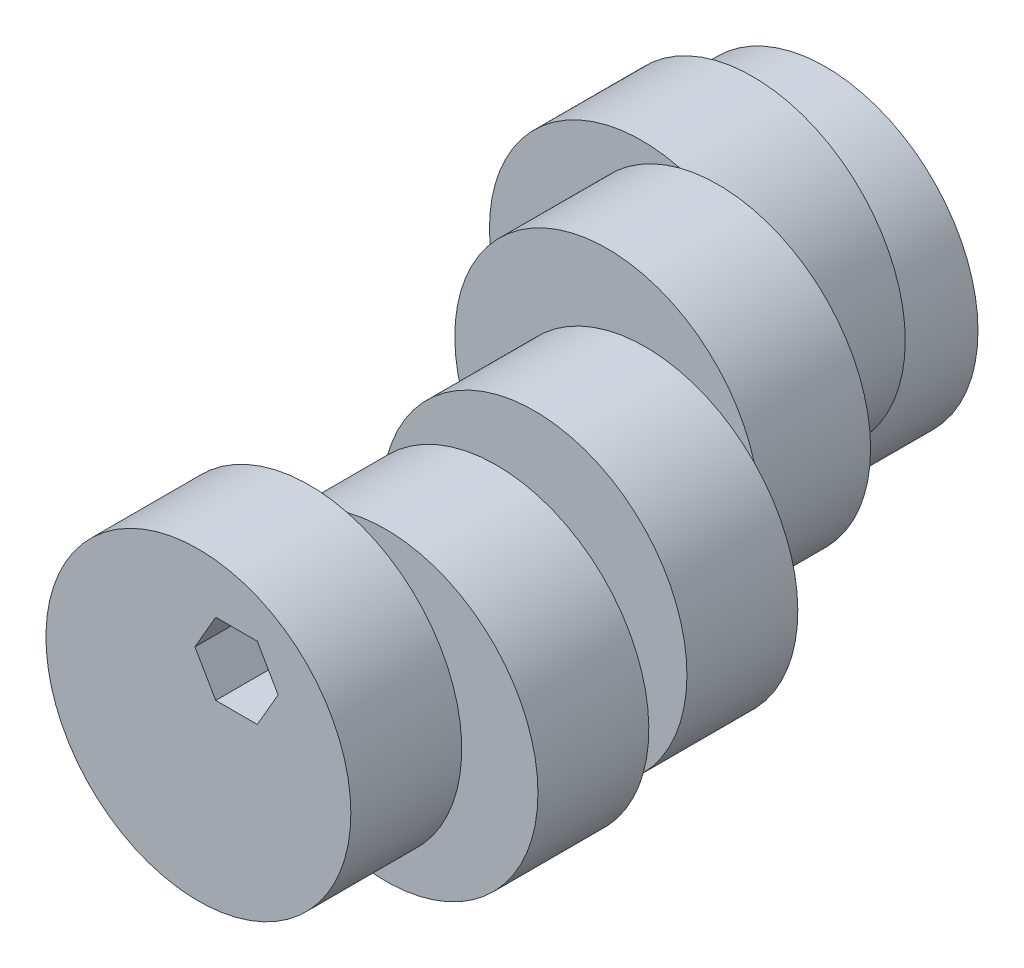
ISO-10303-21;
HEADER;
FILE_DESCRIPTION(('STEP AP214'),'2;1');
FILE_NAME('part.step','',(''),(''),'','','');
FILE_SCHEMA(('AUTOMOTIVE_DESIGN { 1 0 10303 214 1 1 1 1 }'));
ENDSEC;
DATA;
#1=APPLICATION_CONTEXT('core data for automotive mechanical design processes');
#2=APPLICATION_PROTOCOL_DEFINITION('international standard','automotive_design',2000,#1);
#3=PRODUCT_CONTEXT('',#1,'mechanical');
#4=PRODUCT('Part','Part','',(#3));
#5=PRODUCT_RELATED_PRODUCT_CATEGORY('part','',(#4));
#6=PRODUCT_DEFINITION_FORMATION('','',#4);
#7=PRODUCT_DEFINITION_CONTEXT('part definition',#1,'design');
#8=PRODUCT_DEFINITION('design','',#6,#7);
#9=PRODUCT_DEFINITION_SHAPE('','',#8);
#10=(LENGTH_UNIT() NAMED_UNIT(*) SI_UNIT(.MILLI.,.METRE.));
#11=(NAMED_UNIT(*) PLANE_ANGLE_UNIT() SI_UNIT($,.RADIAN.));
#12=(NAMED_UNIT(*) SI_UNIT($,.STERADIAN.) SOLID_ANGLE_UNIT());
#13=UNCERTAINTY_MEASURE_WITH_UNIT(LENGTH_MEASURE(1.E-05),#10,'distance_accuracy_value','');
#14=(GEOMETRIC_REPRESENTATION_CONTEXT(3) GLOBAL_UNCERTAINTY_ASSIGNED_CONTEXT((#13)) GLOBAL_UNIT_ASSIGNED_CONTEXT((#10,
#11,#12)) REPRESENTATION_CONTEXT('',''));
#15=CARTESIAN_POINT('',(0.,0.,0.));
#16=DIRECTION('',(0.,0.,1.));
#17=DIRECTION('',(1.,0.,0.));
#18=AXIS2_PLACEMENT_3D('',#15,#16,#17);
#19=CARTESIAN_POINT('',(0.,0.,8.));
#20=DIRECTION('',(0.,0.,-1.));
#21=DIRECTION('',(-1.,0.,0.));
#22=AXIS2_PLACEMENT_3D('',#19,#20,#21);
#23=CYLINDRICAL_SURFACE('',#22,11.);
#24=CARTESIAN_POINT('',(0.,0.,8.));
#25=DIRECTION('',(0.,0.,1.));
#26=DIRECTION('',(1.,0.,0.));
#27=AXIS2_PLACEMENT_3D('',#24,#25,#26);
#28=CIRCLE('',#27,11.);
#29=CARTESIAN_POINT('',(-7.84878040718658,7.70692196144246,8.));
#30=VERTEX_POINT('',#29);
#31=CARTESIAN_POINT('',(10.5987804071866,-2.94378224062802,8.));
#32=VERTEX_POINT('',#31);
#33=EDGE_CURVE('E243',#30,#32,#28,.T.);
#34=ORIENTED_EDGE('',*,*,#33,.F.);
#35=EDGE_CURVE('E245',#32,#30,#28,.T.);
#36=ORIENTED_EDGE('',*,*,#35,.F.);
#37=EDGE_LOOP('',(#34,#36));
#38=FACE_BOUND('',#37,.T.);
#39=CARTESIAN_POINT('',(0.,0.,0.));
#40=DIRECTION('',(0.,0.,1.));
#41=DIRECTION('',(1.,0.,0.));
#42=AXIS2_PLACEMENT_3D('',#39,#40,#41);
#43=CIRCLE('',#42,11.);
#44=CARTESIAN_POINT('',(11.,0.,0.));
#45=VERTEX_POINT('',#44);
#46=EDGE_CURVE('E48',#45,#45,#43,.T.);
#47=ORIENTED_EDGE('',*,*,#46,.T.);
#48=EDGE_LOOP('',(#47));
#49=FACE_BOUND('',#48,.T.);
#50=ADVANCED_FACE('F45',(#38,#49),#23,.T.);
#51=CARTESIAN_POINT('',(0.,0.,8.));
#52=DIRECTION('',(0.,0.,1.));
#53=DIRECTION('',(1.,0.,0.));
#54=AXIS2_PLACEMENT_3D('',#51,#52,#53);
#55=PLANE('',#54);
#56=CARTESIAN_POINT('',(2.75000000000004,4.76313972081444,8.));
#57=DIRECTION('',(0.,0.,1.));
#58=DIRECTION('',(1.,0.,0.));
#59=AXIS2_PLACEMENT_3D('',#56,#57,#58);
#60=CIRCLE('',#59,11.);
#61=EDGE_CURVE('E240',#30,#32,#60,.T.);
#62=ORIENTED_EDGE('',*,*,#61,.F.);
#63=ORIENTED_EDGE('',*,*,#33,.T.);
#64=EDGE_LOOP('',(#62,#63));
#65=FACE_BOUND('',#64,.T.);
#66=ADVANCED_FACE('F262',(#65),#55,.T.);
#67=CARTESIAN_POINT('',(0.,0.,0.));
#68=DIRECTION('',(0.,0.,1.));
#69=DIRECTION('',(1.,0.,0.));
#70=AXIS2_PLACEMENT_3D('',#67,#68,#69);
#71=PLANE('',#70);
#72=DIRECTION('',(1.,0.,0.));
#73=VECTOR('',#72,1.);
#74=CARTESIAN_POINT('',(4.,-2.59807621135332,0.));
#75=LINE('',#74,#73);
#76=CARTESIAN_POINT('',(4.,-2.59807621135332,0.));
#77=VERTEX_POINT('',#76);
#78=CARTESIAN_POINT('',(7.,-2.59807621135332,0.));
#79=VERTEX_POINT('',#78);
#80=EDGE_CURVE('E140',#77,#79,#75,.T.);
#81=ORIENTED_EDGE('',*,*,#80,.T.);
#82=DIRECTION('',(0.5,0.866025403784439,0.));
#83=VECTOR('',#82,1.);
#84=CARTESIAN_POINT('',(7.,-2.59807621135332,0.));
#85=LINE('',#84,#83);
#86=CARTESIAN_POINT('',(8.5,0.,0.));
#87=VERTEX_POINT('',#86);
#88=EDGE_CURVE('E133',#79,#87,#85,.T.);
#89=ORIENTED_EDGE('',*,*,#88,.T.);
#90=DIRECTION('',(-0.5,0.866025403784439,0.));
#91=VECTOR('',#90,1.);
#92=CARTESIAN_POINT('',(8.5,0.,0.));
#93=LINE('',#92,#91);
#94=CARTESIAN_POINT('',(7.,2.59807621135332,0.));
#95=VERTEX_POINT('',#94);
#96=EDGE_CURVE('E143',#87,#95,#93,.T.);
#97=ORIENTED_EDGE('',*,*,#96,.T.);
#98=DIRECTION('',(-1.,0.,0.));
#99=VECTOR('',#98,1.);
#100=CARTESIAN_POINT('',(7.,2.59807621135332,0.));
#101=LINE('',#100,#99);
#102=CARTESIAN_POINT('',(4.,2.59807621135332,0.));
#103=VERTEX_POINT('',#102);
#104=EDGE_CURVE('E63',#95,#103,#101,.T.);
#105=ORIENTED_EDGE('',*,*,#104,.T.);
#106=DIRECTION('',(-0.5,-0.866025403784439,0.));
#107=VECTOR('',#106,1.);
#108=CARTESIAN_POINT('',(4.,2.59807621135332,0.));
#109=LINE('',#108,#107);
#110=CARTESIAN_POINT('',(2.5,0.,0.));
#111=VERTEX_POINT('',#110);
#112=EDGE_CURVE('E162',#103,#111,#109,.T.);
#113=ORIENTED_EDGE('',*,*,#112,.T.);
#114=DIRECTION('',(0.5,-0.866025403784439,0.));
#115=VECTOR('',#114,1.);
#116=CARTESIAN_POINT('',(2.5,0.,0.));
#117=LINE('',#116,#115);
#118=EDGE_CURVE('E166',#111,#77,#117,.T.);
#119=ORIENTED_EDGE('',*,*,#118,.T.);
#120=EDGE_LOOP('',(#81,#89,#97,#105,#113,#119));
#121=FACE_BOUND('',#120,.T.);
#122=ORIENTED_EDGE('',*,*,#46,.F.);
#123=EDGE_LOOP('',(#122));
#124=FACE_BOUND('',#123,.T.);
#125=ADVANCED_FACE('F148',(#121,#124),#71,.F.);
#126=CARTESIAN_POINT('',(2.75000000000004,4.76313972081444,8.));
#127=DIRECTION('',(0.,0.,1.));
#128=DIRECTION('',(1.,0.,0.));
#129=AXIS2_PLACEMENT_3D('',#126,#127,#128);
#130=PLANE('',#129);
#131=EDGE_CURVE('E230',#32,#30,#60,.T.);
#132=ORIENTED_EDGE('',*,*,#131,.F.);
#133=ORIENTED_EDGE('',*,*,#35,.T.);
#134=EDGE_LOOP('',(#132,#133));
#135=FACE_BOUND('',#134,.T.);
#136=ADVANCED_FACE('F261',(#135),#130,.F.);
#137=CARTESIAN_POINT('',(2.75000000000004,4.76313972081444,16.));
#138=DIRECTION('',(0.,0.,-1.));
#139=DIRECTION('',(-1.,0.,0.));
#140=AXIS2_PLACEMENT_3D('',#137,#138,#139);
#141=CYLINDRICAL_SURFACE('',#140,11.);
#142=CARTESIAN_POINT('',(2.75000000000004,4.76313972081444,16.));
#143=DIRECTION('',(0.,0.,1.));
#144=DIRECTION('',(1.,0.,0.));
#145=AXIS2_PLACEMENT_3D('',#142,#143,#144);
#146=CIRCLE('',#145,11.);
#147=CARTESIAN_POINT('',(5.50000000000005,15.4138439228848,16.));
#148=VERTEX_POINT('',#147);
#149=CARTESIAN_POINT('',(5.49999999999998,-5.88756448125597,16.));
#150=VERTEX_POINT('',#149);
#151=EDGE_CURVE('E236',#148,#150,#146,.T.);
#152=ORIENTED_EDGE('',*,*,#151,.F.);
#153=EDGE_CURVE('E239',#150,#148,#146,.T.);
#154=ORIENTED_EDGE('',*,*,#153,.F.);
#155=EDGE_LOOP('',(#152,#154));
#156=FACE_BOUND('',#155,.T.);
#157=ORIENTED_EDGE('',*,*,#61,.T.);
#158=ORIENTED_EDGE('',*,*,#131,.T.);
#159=EDGE_LOOP('',(#157,#158));
#160=FACE_BOUND('',#159,.T.);
#161=ADVANCED_FACE('F268',(#156,#160),#141,.T.);
#162=CARTESIAN_POINT('',(2.75000000000004,4.76313972081444,16.));
#163=DIRECTION('',(0.,0.,1.));
#164=DIRECTION('',(1.,0.,0.));
#165=AXIS2_PLACEMENT_3D('',#162,#163,#164);
#166=PLANE('',#165);
#167=CARTESIAN_POINT('',(8.24999999999999,4.76313972081442,16.));
#168=DIRECTION('',(0.,0.,1.));
#169=DIRECTION('',(1.,0.,0.));
#170=AXIS2_PLACEMENT_3D('',#167,#168,#169);
#171=CIRCLE('',#170,11.);
#172=EDGE_CURVE('E232',#148,#150,#171,.T.);
#173=ORIENTED_EDGE('',*,*,#172,.F.);
#174=ORIENTED_EDGE('',*,*,#151,.T.);
#175=EDGE_LOOP('',(#173,#174));
#176=FACE_BOUND('',#175,.T.);
#177=ADVANCED_FACE('F279',(#176),#166,.T.);
#178=CARTESIAN_POINT('',(8.24999999999999,4.76313972081442,16.));
#179=DIRECTION('',(0.,0.,1.));
#180=DIRECTION('',(1.,0.,0.));
#181=AXIS2_PLACEMENT_3D('',#178,#179,#180);
#182=PLANE('',#181);
#183=EDGE_CURVE('E221',#150,#148,#171,.T.);
#184=ORIENTED_EDGE('',*,*,#183,.F.);
#185=ORIENTED_EDGE('',*,*,#153,.T.);
#186=EDGE_LOOP('',(#184,#185));
#187=FACE_BOUND('',#186,.T.);
#188=ADVANCED_FACE('F285',(#187),#182,.F.);
#189=CARTESIAN_POINT('',(8.24999999999999,4.76313972081442,24.));
#190=DIRECTION('',(0.,0.,-1.));
#191=DIRECTION('',(-1.,0.,0.));
#192=AXIS2_PLACEMENT_3D('',#189,#190,#191);
#193=CYLINDRICAL_SURFACE('',#192,11.);
#194=CARTESIAN_POINT('',(8.24999999999999,4.76313972081442,24.));
#195=DIRECTION('',(0.,0.,1.));
#196=DIRECTION('',(1.,0.,0.));
#197=AXIS2_PLACEMENT_3D('',#194,#195,#196);
#198=CIRCLE('',#197,11.);
#199=CARTESIAN_POINT('',(18.8487804071866,7.70692196144242,24.));
#200=VERTEX_POINT('',#199);
#201=CARTESIAN_POINT('',(0.401219592813371,-2.943782240628,24.));
#202=VERTEX_POINT('',#201);
#203=EDGE_CURVE('E227',#200,#202,#198,.T.);
#204=ORIENTED_EDGE('',*,*,#203,.F.);
#205=EDGE_CURVE('E231',#202,#200,#198,.T.);
#206=ORIENTED_EDGE('',*,*,#205,.F.);
#207=EDGE_LOOP('',(#204,#206));
#208=FACE_BOUND('',#207,.T.);
#209=ORIENTED_EDGE('',*,*,#172,.T.);
#210=ORIENTED_EDGE('',*,*,#183,.T.);
#211=EDGE_LOOP('',(#209,#210));
#212=FACE_BOUND('',#211,.T.);
#213=ADVANCED_FACE('F290',(#208,#212),#193,.T.);
#214=CARTESIAN_POINT('',(8.24999999999999,4.76313972081442,24.));
#215=DIRECTION('',(0.,0.,1.));
#216=DIRECTION('',(1.,0.,0.));
#217=AXIS2_PLACEMENT_3D('',#214,#215,#216);
#218=PLANE('',#217);
#219=CARTESIAN_POINT('',(11.,0.,24.));
#220=DIRECTION('',(0.,0.,1.));
#221=DIRECTION('',(1.,0.,0.));
#222=AXIS2_PLACEMENT_3D('',#219,#220,#221);
#223=CIRCLE('',#222,11.);
#224=EDGE_CURVE('E223',#200,#202,#223,.T.);
#225=ORIENTED_EDGE('',*,*,#224,.F.);
#226=ORIENTED_EDGE('',*,*,#203,.T.);
#227=EDGE_LOOP('',(#225,#226));
#228=FACE_BOUND('',#227,.T.);
#229=ADVANCED_FACE('F293',(#228),#218,.T.);
#230=CARTESIAN_POINT('',(11.,0.,24.));
#231=DIRECTION('',(0.,0.,1.));
#232=DIRECTION('',(1.,0.,0.));
#233=AXIS2_PLACEMENT_3D('',#230,#231,#232);
#234=PLANE('',#233);
#235=EDGE_CURVE('E212',#202,#200,#223,.T.);
#236=ORIENTED_EDGE('',*,*,#235,.F.);
#237=ORIENTED_EDGE('',*,*,#205,.T.);
#238=EDGE_LOOP('',(#236,#237));
#239=FACE_BOUND('',#238,.T.);
#240=ADVANCED_FACE('F300',(#239),#234,.F.);
#241=CARTESIAN_POINT('',(11.,0.,32.));
#242=DIRECTION('',(0.,0.,-1.));
#243=DIRECTION('',(-1.,0.,0.));
#244=AXIS2_PLACEMENT_3D('',#241,#242,#243);
#245=CYLINDRICAL_SURFACE('',#244,11.);
#246=CARTESIAN_POINT('',(11.,0.,32.));
#247=DIRECTION('',(0.,0.,1.));
#248=DIRECTION('',(1.,0.,0.));
#249=AXIS2_PLACEMENT_3D('',#246,#247,#248);
#250=CIRCLE('',#249,11.);
#251=CARTESIAN_POINT('',(0.401219592813369,2.943782240628,32.));
#252=VERTEX_POINT('',#251);
#253=CARTESIAN_POINT('',(18.8487804071866,-7.70692196144242,32.));
#254=VERTEX_POINT('',#253);
#255=EDGE_CURVE('E217',#252,#254,#250,.T.);
#256=ORIENTED_EDGE('',*,*,#255,.F.);
#257=EDGE_CURVE('E222',#254,#252,#250,.T.);
#258=ORIENTED_EDGE('',*,*,#257,.F.);
#259=EDGE_LOOP('',(#256,#258));
#260=FACE_BOUND('',#259,.T.);
#261=ORIENTED_EDGE('',*,*,#224,.T.);
#262=ORIENTED_EDGE('',*,*,#235,.T.);
#263=EDGE_LOOP('',(#261,#262));
#264=FACE_BOUND('',#263,.T.);
#265=ADVANCED_FACE('F302',(#260,#264),#245,.T.);
#266=CARTESIAN_POINT('',(11.,0.,32.));
#267=DIRECTION('',(0.,0.,1.));
#268=DIRECTION('',(1.,0.,0.));
#269=AXIS2_PLACEMENT_3D('',#266,#267,#268);
#270=PLANE('',#269);
#271=CARTESIAN_POINT('',(8.24999999999999,-4.76313972081442,32.));
#272=DIRECTION('',(0.,0.,1.));
#273=DIRECTION('',(1.,0.,0.));
#274=AXIS2_PLACEMENT_3D('',#271,#272,#273);
#275=CIRCLE('',#274,11.);
#276=EDGE_CURVE('E54',#254,#252,#275,.T.);
#277=ORIENTED_EDGE('',*,*,#276,.F.);
#278=ORIENTED_EDGE('',*,*,#257,.T.);
#279=EDGE_LOOP('',(#277,#278));
#280=FACE_BOUND('',#279,.T.);
#281=ADVANCED_FACE('F305',(#280),#270,.T.);
#282=CARTESIAN_POINT('',(8.24999999999999,-4.76313972081442,32.));
#283=DIRECTION('',(0.,0.,1.));
#284=DIRECTION('',(1.,0.,0.));
#285=AXIS2_PLACEMENT_3D('',#282,#283,#284);
#286=PLANE('',#285);
#287=EDGE_CURVE('E204',#252,#254,#275,.T.);
#288=ORIENTED_EDGE('',*,*,#287,.F.);
#289=ORIENTED_EDGE('',*,*,#255,.T.);
#290=EDGE_LOOP('',(#288,#289));
#291=FACE_BOUND('',#290,.T.);
#292=ADVANCED_FACE('F312',(#291),#286,.F.);
#293=CARTESIAN_POINT('',(8.24999999999999,-4.76313972081442,40.));
#294=DIRECTION('',(0.,0.,-1.));
#295=DIRECTION('',(-1.,0.,0.));
#296=AXIS2_PLACEMENT_3D('',#293,#294,#295);
#297=CYLINDRICAL_SURFACE('',#296,11.);
#298=CARTESIAN_POINT('',(8.24999999999999,-4.76313972081442,40.));
#299=DIRECTION('',(0.,0.,1.));
#300=DIRECTION('',(1.,0.,0.));
#301=AXIS2_PLACEMENT_3D('',#298,#299,#300);
#302=CIRCLE('',#301,11.);
#303=CARTESIAN_POINT('',(5.50000000000002,5.88756448125599,40.));
#304=VERTEX_POINT('',#303);
#305=CARTESIAN_POINT('',(5.49999999999995,-15.4138439228848,40.));
#306=VERTEX_POINT('',#305);
#307=EDGE_CURVE('E208',#304,#306,#302,.T.);
#308=ORIENTED_EDGE('',*,*,#307,.F.);
#309=EDGE_CURVE('E213',#306,#304,#302,.T.);
#310=ORIENTED_EDGE('',*,*,#309,.F.);
#311=EDGE_LOOP('',(#308,#310));
#312=FACE_BOUND('',#311,.T.);
#313=ORIENTED_EDGE('',*,*,#287,.T.);
#314=ORIENTED_EDGE('',*,*,#276,.T.);
#315=EDGE_LOOP('',(#313,#314));
#316=FACE_BOUND('',#315,.T.);
#317=ADVANCED_FACE('F314',(#312,#316),#297,.T.);
#318=CARTESIAN_POINT('',(8.24999999999999,-4.76313972081442,40.));
#319=DIRECTION('',(0.,0.,1.));
#320=DIRECTION('',(1.,0.,0.));
#321=AXIS2_PLACEMENT_3D('',#318,#319,#320);
#322=PLANE('',#321);
#323=CARTESIAN_POINT('',(2.74999999999998,-4.7631397208144,40.));
#324=DIRECTION('',(0.,0.,1.));
#325=DIRECTION('',(1.,0.,0.));
#326=AXIS2_PLACEMENT_3D('',#323,#324,#325);
#327=CIRCLE('',#326,11.);
#328=EDGE_CURVE('E11',#306,#304,#327,.T.);
#329=ORIENTED_EDGE('',*,*,#328,.F.);
#330=ORIENTED_EDGE('',*,*,#309,.T.);
#331=EDGE_LOOP('',(#329,#330));
#332=FACE_BOUND('',#331,.T.);
#333=ADVANCED_FACE('F317',(#332),#322,.T.);
#334=CARTESIAN_POINT('',(2.74999999999998,-4.7631397208144,40.));
#335=DIRECTION('',(0.,0.,1.));
#336=DIRECTION('',(1.,0.,0.));
#337=AXIS2_PLACEMENT_3D('',#334,#335,#336);
#338=PLANE('',#337);
#339=EDGE_CURVE('E56',#304,#306,#327,.T.);
#340=ORIENTED_EDGE('',*,*,#339,.F.);
#341=ORIENTED_EDGE('',*,*,#307,.T.);
#342=EDGE_LOOP('',(#340,#341));
#343=FACE_BOUND('',#342,.T.);
#344=ADVANCED_FACE('F324',(#343),#338,.F.);
#345=CARTESIAN_POINT('',(2.74999999999998,-4.7631397208144,48.));
#346=DIRECTION('',(0.,0.,-1.));
#347=DIRECTION('',(-1.,0.,0.));
#348=AXIS2_PLACEMENT_3D('',#345,#346,#347);
#349=CYLINDRICAL_SURFACE('',#348,11.);
#350=CARTESIAN_POINT('',(2.74999999999998,-4.7631397208144,48.));
#351=DIRECTION('',(0.,0.,1.));
#352=DIRECTION('',(1.,0.,0.));
#353=AXIS2_PLACEMENT_3D('',#350,#351,#352);
#354=CIRCLE('',#353,11.);
#355=CARTESIAN_POINT('',(13.75,-4.7631397208144,48.));
#356=VERTEX_POINT('',#355);
#357=EDGE_CURVE('E201',#356,#356,#354,.T.);
#358=ORIENTED_EDGE('',*,*,#357,.F.);
#359=EDGE_LOOP('',(#358));
#360=FACE_BOUND('',#359,.T.);
#361=ORIENTED_EDGE('',*,*,#339,.T.);
#362=ORIENTED_EDGE('',*,*,#328,.T.);
#363=EDGE_LOOP('',(#361,#362));
#364=FACE_BOUND('',#363,.T.);
#365=ADVANCED_FACE('F326',(#360,#364),#349,.T.);
#366=CARTESIAN_POINT('',(2.74999999999998,-4.7631397208144,48.));
#367=DIRECTION('',(0.,0.,1.));
#368=DIRECTION('',(1.,0.,0.));
#369=AXIS2_PLACEMENT_3D('',#366,#367,#368);
#370=PLANE('',#369);
#371=DIRECTION('',(0.5,0.866025403784439,0.));
#372=VECTOR('',#371,1.);
#373=CARTESIAN_POINT('',(7.,-2.59807621135332,48.));
#374=LINE('',#373,#372);
#375=CARTESIAN_POINT('',(7.,-2.59807621135332,48.));
#376=VERTEX_POINT('',#375);
#377=CARTESIAN_POINT('',(8.5,0.,48.));
#378=VERTEX_POINT('',#377);
#379=EDGE_CURVE('E71',#376,#378,#374,.T.);
#380=ORIENTED_EDGE('',*,*,#379,.F.);
#381=DIRECTION('',(1.,0.,0.));
#382=VECTOR('',#381,1.);
#383=CARTESIAN_POINT('',(4.,-2.59807621135332,48.));
#384=LINE('',#383,#382);
#385=CARTESIAN_POINT('',(4.,-2.59807621135332,48.));
#386=VERTEX_POINT('',#385);
#387=EDGE_CURVE('E153',#386,#376,#384,.T.);
#388=ORIENTED_EDGE('',*,*,#387,.F.);
#389=DIRECTION('',(0.5,-0.866025403784439,0.));
#390=VECTOR('',#389,1.);
#391=CARTESIAN_POINT('',(2.5,0.,48.));
#392=LINE('',#391,#390);
#393=CARTESIAN_POINT('',(2.5,0.,48.));
#394=VERTEX_POINT('',#393);
#395=EDGE_CURVE('E157',#394,#386,#392,.T.);
#396=ORIENTED_EDGE('',*,*,#395,.F.);
#397=DIRECTION('',(-0.5,-0.866025403784439,0.));
#398=VECTOR('',#397,1.);
#399=CARTESIAN_POINT('',(4.,2.59807621135332,48.));
#400=LINE('',#399,#398);
#401=CARTESIAN_POINT('',(4.,2.59807621135332,48.));
#402=VERTEX_POINT('',#401);
#403=EDGE_CURVE('E180',#402,#394,#400,.T.);
#404=ORIENTED_EDGE('',*,*,#403,.F.);
#405=DIRECTION('',(-1.,0.,0.));
#406=VECTOR('',#405,1.);
#407=CARTESIAN_POINT('',(7.,2.59807621135332,48.));
#408=LINE('',#407,#406);
#409=CARTESIAN_POINT('',(7.,2.59807621135332,48.));
#410=VERTEX_POINT('',#409);
#411=EDGE_CURVE('E176',#410,#402,#408,.T.);
#412=ORIENTED_EDGE('',*,*,#411,.F.);
#413=DIRECTION('',(-0.5,0.866025403784439,0.));
#414=VECTOR('',#413,1.);
#415=CARTESIAN_POINT('',(8.5,0.,48.));
#416=LINE('',#415,#414);
#417=EDGE_CURVE('E173',#378,#410,#416,.T.);
#418=ORIENTED_EDGE('',*,*,#417,.F.);
#419=EDGE_LOOP('',(#380,#388,#396,#404,#412,#418));
#420=FACE_BOUND('',#419,.T.);
#421=ORIENTED_EDGE('',*,*,#357,.T.);
#422=EDGE_LOOP('',(#421));
#423=FACE_BOUND('',#422,.T.);
#424=ADVANCED_FACE('F328',(#420,#423),#370,.T.);
#425=CARTESIAN_POINT('',(7.,-2.59807621135332,0.));
#426=DIRECTION('',(0.866025403784438,-0.5,0.));
#427=DIRECTION('',(0.5,0.866025403784439,0.));
#428=AXIS2_PLACEMENT_3D('',#425,#426,#427);
#429=PLANE('',#428);
#430=ORIENTED_EDGE('',*,*,#379,.T.);
#431=DIRECTION('',(0.,0.,1.));
#432=VECTOR('',#431,1.);
#433=CARTESIAN_POINT('',(8.5,0.,0.));
#434=LINE('',#433,#432);
#435=EDGE_CURVE('E129',#87,#378,#434,.T.);
#436=ORIENTED_EDGE('',*,*,#435,.F.);
#437=ORIENTED_EDGE('',*,*,#88,.F.);
#438=DIRECTION('',(0.,0.,1.));
#439=VECTOR('',#438,1.);
#440=CARTESIAN_POINT('',(7.,-2.59807621135332,0.));
#441=LINE('',#440,#439);
#442=EDGE_CURVE('E187',#79,#376,#441,.T.);
#443=ORIENTED_EDGE('',*,*,#442,.T.);
#444=EDGE_LOOP('',(#430,#436,#437,#443));
#445=FACE_BOUND('',#444,.T.);
#446=ADVANCED_FACE('F131',(#445),#429,.F.);
#447=CARTESIAN_POINT('',(4.,-2.59807621135332,0.));
#448=DIRECTION('',(0.,-1.,0.));
#449=DIRECTION('',(1.,0.,0.));
#450=AXIS2_PLACEMENT_3D('',#447,#448,#449);
#451=PLANE('',#450);
#452=ORIENTED_EDGE('',*,*,#387,.T.);
#453=ORIENTED_EDGE('',*,*,#442,.F.);
#454=ORIENTED_EDGE('',*,*,#80,.F.);
#455=DIRECTION('',(0.,0.,1.));
#456=VECTOR('',#455,1.);
#457=CARTESIAN_POINT('',(4.,-2.59807621135332,0.));
#458=LINE('',#457,#456);
#459=EDGE_CURVE('E190',#77,#386,#458,.T.);
#460=ORIENTED_EDGE('',*,*,#459,.T.);
#461=EDGE_LOOP('',(#452,#453,#454,#460));
#462=FACE_BOUND('',#461,.T.);
#463=ADVANCED_FACE('F337',(#462),#451,.F.);
#464=CARTESIAN_POINT('',(2.5,0.,0.));
#465=DIRECTION('',(-0.866025403784439,-0.5,0.));
#466=DIRECTION('',(0.5,-0.866025403784439,0.));
#467=AXIS2_PLACEMENT_3D('',#464,#465,#466);
#468=PLANE('',#467);
#469=ORIENTED_EDGE('',*,*,#395,.T.);
#470=ORIENTED_EDGE('',*,*,#459,.F.);
#471=ORIENTED_EDGE('',*,*,#118,.F.);
#472=DIRECTION('',(0.,0.,1.));
#473=VECTOR('',#472,1.);
#474=CARTESIAN_POINT('',(2.5,0.,0.));
#475=LINE('',#474,#473);
#476=EDGE_CURVE('E193',#111,#394,#475,.T.);
#477=ORIENTED_EDGE('',*,*,#476,.T.);
#478=EDGE_LOOP('',(#469,#470,#471,#477));
#479=FACE_BOUND('',#478,.T.);
#480=ADVANCED_FACE('F346',(#479),#468,.F.);
#481=CARTESIAN_POINT('',(4.,2.59807621135332,0.));
#482=DIRECTION('',(-0.866025403784439,0.5,0.));
#483=DIRECTION('',(-0.5,-0.866025403784439,0.));
#484=AXIS2_PLACEMENT_3D('',#481,#482,#483);
#485=PLANE('',#484);
#486=ORIENTED_EDGE('',*,*,#403,.T.);
#487=ORIENTED_EDGE('',*,*,#476,.F.);
#488=ORIENTED_EDGE('',*,*,#112,.F.);
#489=DIRECTION('',(0.,0.,1.));
#490=VECTOR('',#489,1.);
#491=CARTESIAN_POINT('',(4.,2.59807621135332,0.));
#492=LINE('',#491,#490);
#493=EDGE_CURVE('E196',#103,#402,#492,.T.);
#494=ORIENTED_EDGE('',*,*,#493,.T.);
#495=EDGE_LOOP('',(#486,#487,#488,#494));
#496=FACE_BOUND('',#495,.T.);
#497=ADVANCED_FACE('F343',(#496),#485,.F.);
#498=CARTESIAN_POINT('',(7.,2.59807621135332,0.));
#499=DIRECTION('',(0.,1.,0.));
#500=DIRECTION('',(-1.,0.,0.));
#501=AXIS2_PLACEMENT_3D('',#498,#499,#500);
#502=PLANE('',#501);
#503=ORIENTED_EDGE('',*,*,#411,.T.);
#504=ORIENTED_EDGE('',*,*,#493,.F.);
#505=ORIENTED_EDGE('',*,*,#104,.F.);
#506=DIRECTION('',(0.,0.,1.));
#507=VECTOR('',#506,1.);
#508=CARTESIAN_POINT('',(7.,2.59807621135332,0.));
#509=LINE('',#508,#507);
#510=EDGE_CURVE('E139',#95,#410,#509,.T.);
#511=ORIENTED_EDGE('',*,*,#510,.T.);
#512=EDGE_LOOP('',(#503,#504,#505,#511));
#513=FACE_BOUND('',#512,.T.);
#514=ADVANCED_FACE('F340',(#513),#502,.F.);
#515=CARTESIAN_POINT('',(8.5,0.,0.));
#516=DIRECTION('',(0.866025403784439,0.5,0.));
#517=DIRECTION('',(-0.5,0.866025403784439,0.));
#518=AXIS2_PLACEMENT_3D('',#515,#516,#517);
#519=PLANE('',#518);
#520=ORIENTED_EDGE('',*,*,#417,.T.);
#521=ORIENTED_EDGE('',*,*,#510,.F.);
#522=ORIENTED_EDGE('',*,*,#96,.F.);
#523=ORIENTED_EDGE('',*,*,#435,.T.);
#524=EDGE_LOOP('',(#520,#521,#522,#523));
#525=FACE_BOUND('',#524,.T.);
#526=ADVANCED_FACE('F144',(#525),#519,.F.);
#527=CLOSED_SHELL('',(#50,#66,#125,#136,#161,#177,#188,#213,#229,#240,#265,#281,#292,#317,#333,
#344,#365,#424,#446,#463,#480,#497,#514,#526));
#528=MANIFOLD_SOLID_BREP('B2',#527);
#529=ADVANCED_BREP_SHAPE_REPRESENTATION('',(#18,#528),#14);
#530=SHAPE_DEFINITION_REPRESENTATION(#9,#529);
ENDSEC;
END-ISO-10303-21;
